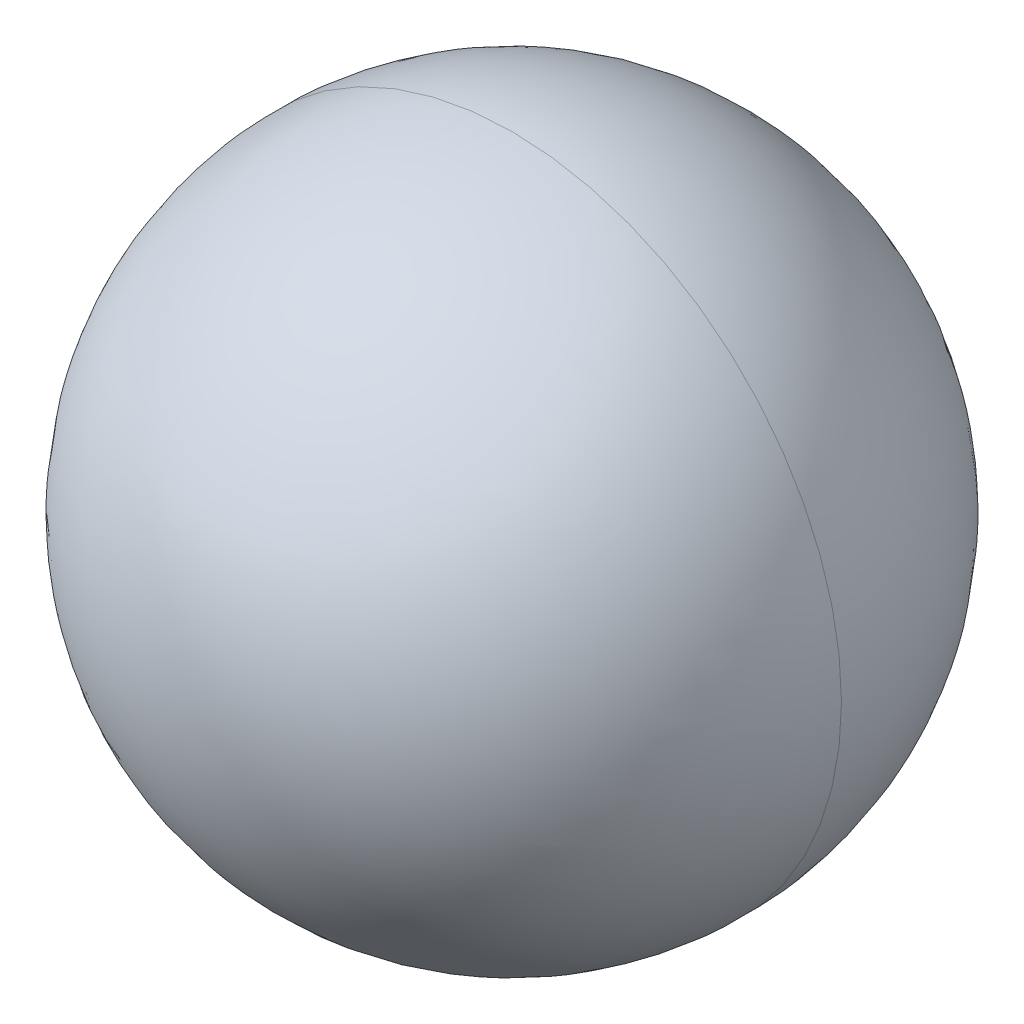
ISO-10303-21;
HEADER;
FILE_DESCRIPTION(('STEP AP214'),'2;1');
FILE_NAME('part.step','',(''),(''),'','','');
FILE_SCHEMA(('AUTOMOTIVE_DESIGN { 1 0 10303 214 1 1 1 1 }'));
ENDSEC;
DATA;
#1=APPLICATION_CONTEXT('core data for automotive mechanical design processes');
#2=APPLICATION_PROTOCOL_DEFINITION('international standard','automotive_design',2000,#1);
#3=PRODUCT_CONTEXT('',#1,'mechanical');
#4=PRODUCT('Part','Part','',(#3));
#5=PRODUCT_RELATED_PRODUCT_CATEGORY('part','',(#4));
#6=PRODUCT_DEFINITION_FORMATION('','',#4);
#7=PRODUCT_DEFINITION_CONTEXT('part definition',#1,'design');
#8=PRODUCT_DEFINITION('design','',#6,#7);
#9=PRODUCT_DEFINITION_SHAPE('','',#8);
#10=(LENGTH_UNIT() NAMED_UNIT(*) SI_UNIT(.MILLI.,.METRE.));
#11=(NAMED_UNIT(*) PLANE_ANGLE_UNIT() SI_UNIT($,.RADIAN.));
#12=(NAMED_UNIT(*) SI_UNIT($,.STERADIAN.) SOLID_ANGLE_UNIT());
#13=UNCERTAINTY_MEASURE_WITH_UNIT(LENGTH_MEASURE(1.E-05),#10,'distance_accuracy_value','');
#14=(GEOMETRIC_REPRESENTATION_CONTEXT(3) GLOBAL_UNCERTAINTY_ASSIGNED_CONTEXT((#13)) GLOBAL_UNIT_ASSIGNED_CONTEXT((#10,
#11,#12)) REPRESENTATION_CONTEXT('',''));
#15=CARTESIAN_POINT('',(0.,0.,0.));
#16=DIRECTION('',(0.,0.,1.));
#17=DIRECTION('',(1.,0.,0.));
#18=AXIS2_PLACEMENT_3D('',#15,#16,#17);
#19=CARTESIAN_POINT('',(25.787600097656,22.367800292969,-0.132100000381));
#20=CARTESIAN_POINT('',(25.787600097656,22.367800292969,-0.132100000381));
#21=CARTESIAN_POINT('',(25.787600097656,22.367800292969,-0.132100000381));
#22=CARTESIAN_POINT('',(25.787600097656,22.367800292969,-0.132100000381));
#23=CARTESIAN_POINT('',(25.532600097656,22.367800292969,-0.132100000381));
#24=CARTESIAN_POINT('',(25.532600097656,22.367800292969,-0.642100000381));
#25=CARTESIAN_POINT('',(26.042600097656,22.367800292969,-0.642100000381));
#26=CARTESIAN_POINT('',(26.042600097656,22.367800292969,-0.132100000381));
#27=CARTESIAN_POINT('',(25.532600097656,22.622800292969,-0.132100000381));
#28=CARTESIAN_POINT('',(25.532600097656,22.622800292969,-0.642100000381));
#29=CARTESIAN_POINT('',(26.042600097656,22.622800292969,-0.642100000381));
#30=CARTESIAN_POINT('',(26.042600097656,22.622800292969,-0.132100000381));
#31=CARTESIAN_POINT('',(25.787600097656,22.622800292969,-0.132100000381));
#32=CARTESIAN_POINT('',(25.787600097656,22.622800292969,-0.132100000381));
#33=CARTESIAN_POINT('',(25.787600097656,22.622800292969,-0.132100000381));
#34=CARTESIAN_POINT('',(25.787600097656,22.622800292969,-0.132100000381));
#35=(BOUNDED_SURFACE() B_SPLINE_SURFACE(3,3,((#19,#20,#21,#22),(#23,#24,#25,#26),(#27,#28,#29,
#30),(#31,#32,#33,#34)),.UNSPECIFIED.,.F.,.F.,.F.) B_SPLINE_SURFACE_WITH_KNOTS((4,4),(4,4),(0.,
1.),(0.,1.),.UNSPECIFIED.) GEOMETRIC_REPRESENTATION_ITEM() RATIONAL_B_SPLINE_SURFACE(((1.,
0.333333333333,0.333333333333,1.),(0.333333333333,0.111111111111,0.111111111111,0.333333333333),
(0.333333333333,0.111111111111,0.111111111111,0.333333333333),(1.,0.333333333333,0.333333333333,1.))) REPRESENTATION_ITEM('') SURFACE());
#36=CARTESIAN_POINT('',(25.787600097656,22.495300292969,-0.132100000381));
#37=DIRECTION('',(0.,0.,1.));
#38=DIRECTION('',(0.,-1.,0.));
#39=AXIS2_PLACEMENT_3D('',#36,#37,#38);
#40=CIRCLE('',#39,0.1275);
#41=CARTESIAN_POINT('',(25.787600097656,22.367800292969,-0.132100000381));
#42=VERTEX_POINT('',#41);
#43=CARTESIAN_POINT('',(25.787600097656,22.622800292969,-0.132100000381));
#44=VERTEX_POINT('',#43);
#45=EDGE_CURVE('E11',#42,#44,#40,.T.);
#46=CARTESIAN_POINT('',(25.787600097656,22.495300292969,-0.132100000381));
#47=DIRECTION('',(0.,0.,-1.));
#48=DIRECTION('',(0.,-1.,0.));
#49=AXIS2_PLACEMENT_3D('',#46,#47,#48);
#50=CIRCLE('',#49,0.1275);
#51=EDGE_CURVE('E22',#42,#44,#50,.T.);
#52=ORIENTED_EDGE('',*,*,#45,.F.);
#53=ORIENTED_EDGE('',*,*,#51,.T.);
#54=EDGE_LOOP('',(#52,#53));
#55=FACE_BOUND('',#54,.T.);
#56=ADVANCED_FACE('F17',(#55),#35,.T.);
#57=CARTESIAN_POINT('',(25.787600097656,22.367800292969,-0.132100000381));
#58=CARTESIAN_POINT('',(25.787600097656,22.367800292969,-0.132100000381));
#59=CARTESIAN_POINT('',(25.787600097656,22.367800292969,-0.132100000381));
#60=CARTESIAN_POINT('',(25.787600097656,22.367800292969,-0.132100000381));
#61=CARTESIAN_POINT('',(26.042600097656,22.367800292969,-0.132100000381));
#62=CARTESIAN_POINT('',(26.042600097656,22.367800292969,0.377899999619));
#63=CARTESIAN_POINT('',(25.532600097656,22.367800292969,0.377899999619));
#64=CARTESIAN_POINT('',(25.532600097656,22.367800292969,-0.132100000381));
#65=CARTESIAN_POINT('',(26.042600097656,22.622800292969,-0.132100000381));
#66=CARTESIAN_POINT('',(26.042600097656,22.622800292969,0.377899999619));
#67=CARTESIAN_POINT('',(25.532600097656,22.622800292969,0.377899999619));
#68=CARTESIAN_POINT('',(25.532600097656,22.622800292969,-0.132100000381));
#69=CARTESIAN_POINT('',(25.787600097656,22.622800292969,-0.132100000381));
#70=CARTESIAN_POINT('',(25.787600097656,22.622800292969,-0.132100000381));
#71=CARTESIAN_POINT('',(25.787600097656,22.622800292969,-0.132100000381));
#72=CARTESIAN_POINT('',(25.787600097656,22.622800292969,-0.132100000381));
#73=(BOUNDED_SURFACE() B_SPLINE_SURFACE(3,3,((#57,#58,#59,#60),(#61,#62,#63,#64),(#65,#66,#67,
#68),(#69,#70,#71,#72)),.UNSPECIFIED.,.F.,.F.,.F.) B_SPLINE_SURFACE_WITH_KNOTS((4,4),(4,4),(0.,
1.),(0.,1.),.UNSPECIFIED.) GEOMETRIC_REPRESENTATION_ITEM() RATIONAL_B_SPLINE_SURFACE(((1.,
0.333333333333,0.333333333333,1.),(0.333333333333,0.111111111111,0.111111111111,0.333333333333),
(0.333333333333,0.111111111111,0.111111111111,0.333333333333),(1.,0.333333333333,0.333333333333,1.))) REPRESENTATION_ITEM('') SURFACE());
#74=ORIENTED_EDGE('',*,*,#51,.F.);
#75=ORIENTED_EDGE('',*,*,#45,.T.);
#76=EDGE_LOOP('',(#74,#75));
#77=FACE_BOUND('',#76,.T.);
#78=ADVANCED_FACE('F41',(#77),#73,.T.);
#79=CLOSED_SHELL('',(#56,#78));
#80=MANIFOLD_SOLID_BREP('B1',#79);
#81=ADVANCED_BREP_SHAPE_REPRESENTATION('',(#18,#80),#14);
#82=SHAPE_DEFINITION_REPRESENTATION(#9,#81);
ENDSEC;
END-ISO-10303-21;
